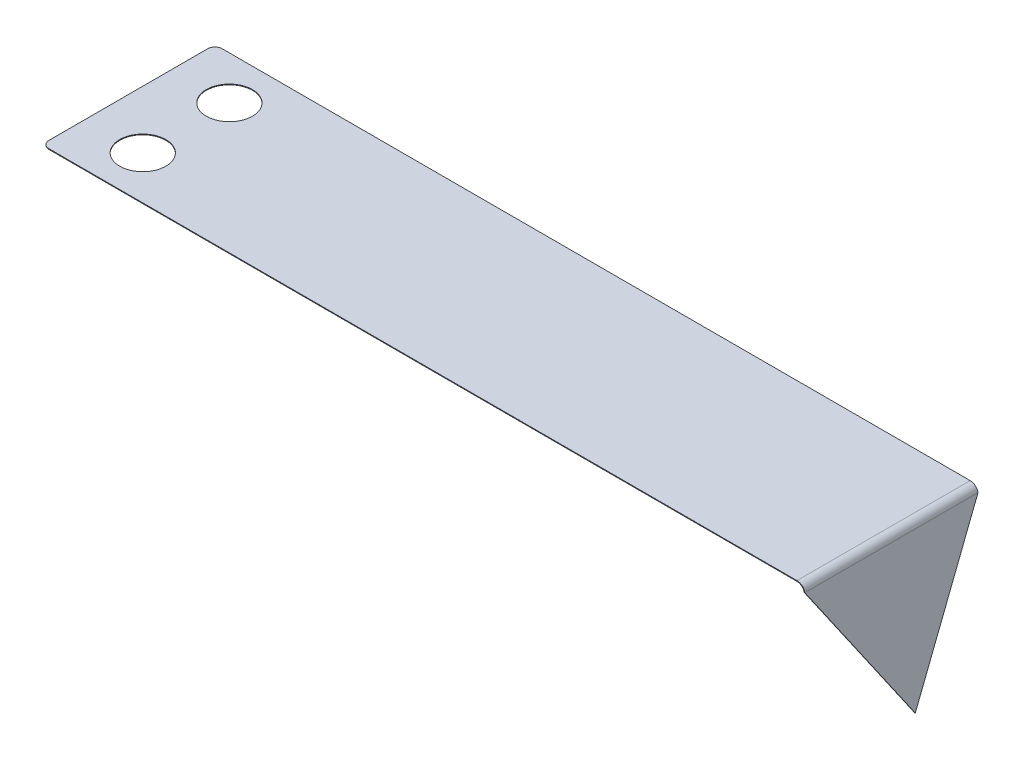
ISO-10303-21;
HEADER;
FILE_DESCRIPTION(('STEP AP214'),'2;1');
FILE_NAME('part.step','',(''),(''),'','','');
FILE_SCHEMA(('AUTOMOTIVE_DESIGN { 1 0 10303 214 1 1 1 1 }'));
ENDSEC;
DATA;
#1=APPLICATION_CONTEXT('core data for automotive mechanical design processes');
#2=APPLICATION_PROTOCOL_DEFINITION('international standard','automotive_design',2000,#1);
#3=PRODUCT_CONTEXT('',#1,'mechanical');
#4=PRODUCT('Part','Part','',(#3));
#5=PRODUCT_RELATED_PRODUCT_CATEGORY('part','',(#4));
#6=PRODUCT_DEFINITION_FORMATION('','',#4);
#7=PRODUCT_DEFINITION_CONTEXT('part definition',#1,'design');
#8=PRODUCT_DEFINITION('design','',#6,#7);
#9=PRODUCT_DEFINITION_SHAPE('','',#8);
#10=(LENGTH_UNIT() NAMED_UNIT(*) SI_UNIT(.MILLI.,.METRE.));
#11=(NAMED_UNIT(*) PLANE_ANGLE_UNIT() SI_UNIT($,.RADIAN.));
#12=(NAMED_UNIT(*) SI_UNIT($,.STERADIAN.) SOLID_ANGLE_UNIT());
#13=UNCERTAINTY_MEASURE_WITH_UNIT(LENGTH_MEASURE(1.E-05),#10,'distance_accuracy_value','');
#14=(GEOMETRIC_REPRESENTATION_CONTEXT(3) GLOBAL_UNCERTAINTY_ASSIGNED_CONTEXT((#13)) GLOBAL_UNIT_ASSIGNED_CONTEXT((#10,
#11,#12)) REPRESENTATION_CONTEXT('',''));
#15=CARTESIAN_POINT('',(0.,0.,0.));
#16=DIRECTION('',(0.,0.,1.));
#17=DIRECTION('',(1.,0.,0.));
#18=AXIS2_PLACEMENT_3D('',#15,#16,#17);
#19=CARTESIAN_POINT('',(25.5938611478472,4.52184061630192,0.));
#20=DIRECTION('',(-0.984807753012208,-0.173648177666934,0.));
#21=DIRECTION('',(0.173648177666934,-0.984807753012207,0.));
#22=AXIS2_PLACEMENT_3D('',#19,#20,#21);
#23=PLANE('',#22);
#24=DIRECTION('',(-0.146986514273729,0.83360194612956,-0.532449772307838));
#25=VECTOR('',#24,1.);
#26=CARTESIAN_POINT('',(28.1276654276339,-9.84807753012207,0.));
#27=LINE('',#26,#25);
#28=CARTESIAN_POINT('',(28.1276654276339,-9.84807753012207,0.));
#29=VERTEX_POINT('',#28);
#30=CARTESIAN_POINT('',(26.4713231179738,-0.454493502283187,-6.));
#31=VERTEX_POINT('',#30);
#32=EDGE_CURVE('E149',#29,#31,#27,.T.);
#33=ORIENTED_EDGE('',*,*,#32,.T.);
#34=DIRECTION('',(0.,0.,1.));
#35=VECTOR('',#34,1.);
#36=CARTESIAN_POINT('',(26.4713231179738,-0.454493502283186,-6.));
#37=LINE('',#36,#35);
#38=CARTESIAN_POINT('',(26.4713231179738,-0.454493502283186,6.));
#39=VERTEX_POINT('',#38);
#40=EDGE_CURVE('E180',#39,#31,#37,.F.);
#41=ORIENTED_EDGE('',*,*,#40,.F.);
#42=DIRECTION('',(-0.146986514273729,0.83360194612956,0.532449772307838));
#43=VECTOR('',#42,1.);
#44=CARTESIAN_POINT('',(26.3122016545442,0.447929160375928,6.57640789286689));
#45=LINE('',#44,#43);
#46=EDGE_CURVE('E274',#29,#39,#45,.T.);
#47=ORIENTED_EDGE('',*,*,#46,.F.);
#48=EDGE_LOOP('',(#33,#41,#47));
#49=FACE_BOUND('',#48,.T.);
#50=ADVANCED_FACE('F65',(#49),#23,.F.);
#51=CARTESIAN_POINT('',(25.5446207601965,4.51315820741857,0.));
#52=DIRECTION('',(-0.984807753012208,-0.173648177666934,0.));
#53=DIRECTION('',(0.173648177666934,-0.984807753012207,0.));
#54=AXIS2_PLACEMENT_3D('',#51,#52,#53);
#55=PLANE('',#54);
#56=DIRECTION('',(0.,0.,1.));
#57=VECTOR('',#56,1.);
#58=CARTESIAN_POINT('',(26.4220827303232,-0.463175911166534,-6.));
#59=LINE('',#58,#57);
#60=CARTESIAN_POINT('',(26.4220827303232,-0.463175911166533,-6.));
#61=VERTEX_POINT('',#60);
#62=CARTESIAN_POINT('',(26.4220827303232,-0.463175911166534,6.));
#63=VERTEX_POINT('',#62);
#64=EDGE_CURVE('E161',#61,#63,#59,.T.);
#65=ORIENTED_EDGE('',*,*,#64,.F.);
#66=DIRECTION('',(-0.146986514273729,0.83360194612956,-0.532449772307838));
#67=VECTOR('',#66,1.);
#68=CARTESIAN_POINT('',(28.0784250399833,-9.85675993900542,0.));
#69=LINE('',#68,#67);
#70=CARTESIAN_POINT('',(28.0784250399833,-9.85675993900542,0.));
#71=VERTEX_POINT('',#70);
#72=EDGE_CURVE('E136',#71,#61,#69,.T.);
#73=ORIENTED_EDGE('',*,*,#72,.F.);
#74=DIRECTION('',(-0.146986514273729,0.83360194612956,0.532449772307838));
#75=VECTOR('',#74,1.);
#76=CARTESIAN_POINT('',(26.2629612668936,0.439246751492581,6.57640789286689));
#77=LINE('',#76,#75);
#78=EDGE_CURVE('E148',#71,#63,#77,.T.);
#79=ORIENTED_EDGE('',*,*,#78,.T.);
#80=EDGE_LOOP('',(#65,#73,#79));
#81=FACE_BOUND('',#80,.T.);
#82=ADVANCED_FACE('F174',(#81),#55,.T.);
#83=CARTESIAN_POINT('',(-26.4,-0.05,6.));
#84=DIRECTION('',(0.,0.,1.));
#85=DIRECTION('',(1.,0.,0.));
#86=AXIS2_PLACEMENT_3D('',#83,#84,#85);
#87=PLANE('',#86);
#88=DIRECTION('',(1.,0.,0.));
#89=VECTOR('',#88,1.);
#90=CARTESIAN_POINT('',(-26.4,0.,6.));
#91=LINE('',#90,#89);
#92=CARTESIAN_POINT('',(-25.9,0.,6.));
#93=VERTEX_POINT('',#92);
#94=CARTESIAN_POINT('',(25.9296788538171,0.,6.));
#95=VERTEX_POINT('',#94);
#96=EDGE_CURVE('E210',#93,#95,#91,.T.);
#97=ORIENTED_EDGE('',*,*,#96,.F.);
#98=DIRECTION('',(0.,1.,0.));
#99=VECTOR('',#98,1.);
#100=CARTESIAN_POINT('',(-25.9,-0.05,6.));
#101=LINE('',#100,#99);
#102=CARTESIAN_POINT('',(-25.9,-0.05,6.));
#103=VERTEX_POINT('',#102);
#104=EDGE_CURVE('E13',#93,#103,#101,.F.);
#105=ORIENTED_EDGE('',*,*,#104,.T.);
#106=DIRECTION('',(1.,0.,0.));
#107=VECTOR('',#106,1.);
#108=CARTESIAN_POINT('',(-26.4,-0.05,6.));
#109=LINE('',#108,#107);
#110=CARTESIAN_POINT('',(25.9296788538171,-0.05,6.));
#111=VERTEX_POINT('',#110);
#112=EDGE_CURVE('E213',#103,#111,#109,.T.);
#113=ORIENTED_EDGE('',*,*,#112,.T.);
#114=DIRECTION('',(0.,1.,0.));
#115=VECTOR('',#114,1.);
#116=CARTESIAN_POINT('',(25.9296788538171,-0.0500000000000014,6.));
#117=LINE('',#116,#115);
#118=EDGE_CURVE('E189',#111,#95,#117,.T.);
#119=ORIENTED_EDGE('',*,*,#118,.T.);
#120=EDGE_LOOP('',(#97,#105,#113,#119));
#121=FACE_BOUND('',#120,.T.);
#122=ADVANCED_FACE('F261',(#121),#87,.T.);
#123=CARTESIAN_POINT('',(0.,-0.05,0.));
#124=DIRECTION('',(0.,-1.,0.));
#125=DIRECTION('',(0.,0.,-1.));
#126=AXIS2_PLACEMENT_3D('',#123,#124,#125);
#127=PLANE('',#126);
#128=CARTESIAN_POINT('',(-22.4,-0.0499999999999997,-3.));
#129=DIRECTION('',(0.,-1.,0.));
#130=DIRECTION('',(0.,0.,-1.));
#131=AXIS2_PLACEMENT_3D('',#128,#129,#130);
#132=CIRCLE('',#131,1.6);
#133=CARTESIAN_POINT('',(-22.4,-0.0499999999999997,-4.6));
#134=VERTEX_POINT('',#133);
#135=EDGE_CURVE('E284',#134,#134,#132,.T.);
#136=ORIENTED_EDGE('',*,*,#135,.F.);
#137=EDGE_LOOP('',(#136));
#138=FACE_BOUND('',#137,.T.);
#139=CARTESIAN_POINT('',(-22.4,-0.0499999999999997,3.));
#140=DIRECTION('',(0.,-1.,0.));
#141=DIRECTION('',(0.,0.,-1.));
#142=AXIS2_PLACEMENT_3D('',#139,#140,#141);
#143=CIRCLE('',#142,1.6);
#144=CARTESIAN_POINT('',(-22.4,-0.0499999999999997,1.4));
#145=VERTEX_POINT('',#144);
#146=EDGE_CURVE('E289',#145,#145,#143,.T.);
#147=ORIENTED_EDGE('',*,*,#146,.F.);
#148=EDGE_LOOP('',(#147));
#149=FACE_BOUND('',#148,.T.);
#150=DIRECTION('',(0.,0.,1.));
#151=VECTOR('',#150,1.);
#152=CARTESIAN_POINT('',(-26.4,-0.05,6.));
#153=LINE('',#152,#151);
#154=CARTESIAN_POINT('',(-26.4,-0.05,-5.5));
#155=VERTEX_POINT('',#154);
#156=CARTESIAN_POINT('',(-26.4,-0.05,5.5));
#157=VERTEX_POINT('',#156);
#158=EDGE_CURVE('E209',#155,#157,#153,.T.);
#159=ORIENTED_EDGE('',*,*,#158,.F.);
#160=CARTESIAN_POINT('',(-25.9,-0.05,-5.5));
#161=DIRECTION('',(0.,-1.,0.));
#162=DIRECTION('',(0.,0.,-1.));
#163=AXIS2_PLACEMENT_3D('',#160,#161,#162);
#164=CIRCLE('',#163,0.5);
#165=CARTESIAN_POINT('',(-25.9,-0.05,-6.));
#166=VERTEX_POINT('',#165);
#167=EDGE_CURVE('E74',#155,#166,#164,.T.);
#168=ORIENTED_EDGE('',*,*,#167,.T.);
#169=DIRECTION('',(-1.,0.,0.));
#170=VECTOR('',#169,1.);
#171=CARTESIAN_POINT('',(-26.4,-0.05,-6.));
#172=LINE('',#171,#170);
#173=CARTESIAN_POINT('',(25.9296788538171,-0.05,-6.));
#174=VERTEX_POINT('',#173);
#175=EDGE_CURVE('E205',#174,#166,#172,.T.);
#176=ORIENTED_EDGE('',*,*,#175,.F.);
#177=DIRECTION('',(0.,0.,1.));
#178=VECTOR('',#177,1.);
#179=CARTESIAN_POINT('',(25.9296788538171,-0.0500000000000014,6.));
#180=LINE('',#179,#178);
#181=EDGE_CURVE('E170',#111,#174,#180,.F.);
#182=ORIENTED_EDGE('',*,*,#181,.F.);
#183=ORIENTED_EDGE('',*,*,#112,.F.);
#184=CARTESIAN_POINT('',(-25.9,-0.05,5.5));
#185=DIRECTION('',(0.,-1.,0.));
#186=DIRECTION('',(0.,0.,-1.));
#187=AXIS2_PLACEMENT_3D('',#184,#185,#186);
#188=CIRCLE('',#187,0.5);
#189=EDGE_CURVE('E86',#103,#157,#188,.T.);
#190=ORIENTED_EDGE('',*,*,#189,.T.);
#191=EDGE_LOOP('',(#159,#168,#176,#182,#183,#190));
#192=FACE_BOUND('',#191,.T.);
#193=ADVANCED_FACE('F246',(#138,#149,#192),#127,.T.);
#194=CARTESIAN_POINT('',(0.,0.,0.));
#195=DIRECTION('',(0.,-1.,0.));
#196=DIRECTION('',(0.,0.,-1.));
#197=AXIS2_PLACEMENT_3D('',#194,#195,#196);
#198=PLANE('',#197);
#199=CARTESIAN_POINT('',(-22.4,0.,-3.));
#200=DIRECTION('',(0.,1.,0.));
#201=DIRECTION('',(0.,0.,1.));
#202=AXIS2_PLACEMENT_3D('',#199,#200,#201);
#203=CIRCLE('',#202,1.6);
#204=CARTESIAN_POINT('',(-22.4,0.,-1.4));
#205=VERTEX_POINT('',#204);
#206=EDGE_CURVE('E293',#205,#205,#203,.T.);
#207=ORIENTED_EDGE('',*,*,#206,.F.);
#208=EDGE_LOOP('',(#207));
#209=FACE_BOUND('',#208,.T.);
#210=CARTESIAN_POINT('',(-22.4,0.,3.));
#211=DIRECTION('',(0.,1.,0.));
#212=DIRECTION('',(0.,0.,1.));
#213=AXIS2_PLACEMENT_3D('',#210,#211,#212);
#214=CIRCLE('',#213,1.6);
#215=CARTESIAN_POINT('',(-22.4,0.,4.6));
#216=VERTEX_POINT('',#215);
#217=EDGE_CURVE('E294',#216,#216,#214,.T.);
#218=ORIENTED_EDGE('',*,*,#217,.F.);
#219=EDGE_LOOP('',(#218));
#220=FACE_BOUND('',#219,.T.);
#221=DIRECTION('',(-1.,0.,0.));
#222=VECTOR('',#221,1.);
#223=CARTESIAN_POINT('',(-26.4,0.,-6.));
#224=LINE('',#223,#222);
#225=CARTESIAN_POINT('',(25.9296788538171,0.,-6.));
#226=VERTEX_POINT('',#225);
#227=CARTESIAN_POINT('',(-25.9,0.,-6.));
#228=VERTEX_POINT('',#227);
#229=EDGE_CURVE('E201',#226,#228,#224,.T.);
#230=ORIENTED_EDGE('',*,*,#229,.T.);
#231=CARTESIAN_POINT('',(-25.9,0.,-5.5));
#232=DIRECTION('',(0.,-1.,0.));
#233=DIRECTION('',(0.,0.,-1.));
#234=AXIS2_PLACEMENT_3D('',#231,#232,#233);
#235=CIRCLE('',#234,0.5);
#236=CARTESIAN_POINT('',(-26.4,0.,-5.5));
#237=VERTEX_POINT('',#236);
#238=EDGE_CURVE('E232',#228,#237,#235,.F.);
#239=ORIENTED_EDGE('',*,*,#238,.T.);
#240=DIRECTION('',(0.,0.,1.));
#241=VECTOR('',#240,1.);
#242=CARTESIAN_POINT('',(-26.4,0.,6.));
#243=LINE('',#242,#241);
#244=CARTESIAN_POINT('',(-26.4,0.,5.5));
#245=VERTEX_POINT('',#244);
#246=EDGE_CURVE('E220',#237,#245,#243,.T.);
#247=ORIENTED_EDGE('',*,*,#246,.T.);
#248=CARTESIAN_POINT('',(-25.9,0.,5.5));
#249=DIRECTION('',(0.,-1.,0.));
#250=DIRECTION('',(0.,0.,-1.));
#251=AXIS2_PLACEMENT_3D('',#248,#249,#250);
#252=CIRCLE('',#251,0.5);
#253=EDGE_CURVE('E229',#245,#93,#252,.F.);
#254=ORIENTED_EDGE('',*,*,#253,.T.);
#255=ORIENTED_EDGE('',*,*,#96,.T.);
#256=DIRECTION('',(0.,0.,1.));
#257=VECTOR('',#256,1.);
#258=CARTESIAN_POINT('',(25.9296788538171,0.,6.));
#259=LINE('',#258,#257);
#260=EDGE_CURVE('E184',#95,#226,#259,.F.);
#261=ORIENTED_EDGE('',*,*,#260,.T.);
#262=EDGE_LOOP('',(#230,#239,#247,#254,#255,#261));
#263=FACE_BOUND('',#262,.T.);
#264=ADVANCED_FACE('F256',(#209,#220,#263),#198,.F.);
#265=CARTESIAN_POINT('',(-26.4,-0.05,6.));
#266=DIRECTION('',(-1.,0.,0.));
#267=DIRECTION('',(0.,0.,1.));
#268=AXIS2_PLACEMENT_3D('',#265,#266,#267);
#269=PLANE('',#268);
#270=ORIENTED_EDGE('',*,*,#246,.F.);
#271=DIRECTION('',(0.,1.,0.));
#272=VECTOR('',#271,1.);
#273=CARTESIAN_POINT('',(-26.4,-0.05,-5.5));
#274=LINE('',#273,#272);
#275=EDGE_CURVE('E239',#237,#155,#274,.F.);
#276=ORIENTED_EDGE('',*,*,#275,.T.);
#277=ORIENTED_EDGE('',*,*,#158,.T.);
#278=DIRECTION('',(0.,1.,0.));
#279=VECTOR('',#278,1.);
#280=CARTESIAN_POINT('',(-26.4,-0.05,5.5));
#281=LINE('',#280,#279);
#282=EDGE_CURVE('E235',#157,#245,#281,.T.);
#283=ORIENTED_EDGE('',*,*,#282,.T.);
#284=EDGE_LOOP('',(#270,#276,#277,#283));
#285=FACE_BOUND('',#284,.T.);
#286=ADVANCED_FACE('F258',(#285),#269,.T.);
#287=CARTESIAN_POINT('',(-26.4,-0.05,-6.));
#288=DIRECTION('',(0.,0.,-1.));
#289=DIRECTION('',(-1.,0.,0.));
#290=AXIS2_PLACEMENT_3D('',#287,#288,#289);
#291=PLANE('',#290);
#292=ORIENTED_EDGE('',*,*,#175,.T.);
#293=DIRECTION('',(0.,1.,0.));
#294=VECTOR('',#293,1.);
#295=CARTESIAN_POINT('',(-25.9,-0.05,-6.));
#296=LINE('',#295,#294);
#297=EDGE_CURVE('E216',#166,#228,#296,.T.);
#298=ORIENTED_EDGE('',*,*,#297,.T.);
#299=ORIENTED_EDGE('',*,*,#229,.F.);
#300=DIRECTION('',(0.,1.,0.));
#301=VECTOR('',#300,1.);
#302=CARTESIAN_POINT('',(25.9296788538171,-0.0500000000000014,-6.));
#303=LINE('',#302,#301);
#304=EDGE_CURVE('E198',#174,#226,#303,.T.);
#305=ORIENTED_EDGE('',*,*,#304,.F.);
#306=EDGE_LOOP('',(#292,#298,#299,#305));
#307=FACE_BOUND('',#306,.T.);
#308=ADVANCED_FACE('F251',(#307),#291,.T.);
#309=CARTESIAN_POINT('',(25.9296788538171,-0.550000000000001,-6.));
#310=DIRECTION('',(0.,0.,-1.));
#311=DIRECTION('',(-1.,0.,0.));
#312=AXIS2_PLACEMENT_3D('',#309,#310,#311);
#313=PLANE('',#312);
#314=DIRECTION('',(-0.984807753012207,-0.173648177666934,0.));
#315=VECTOR('',#314,1.);
#316=CARTESIAN_POINT('',(26.4713231179738,-0.454493502283187,-6.));
#317=LINE('',#316,#315);
#318=EDGE_CURVE('E139',#61,#31,#317,.F.);
#319=ORIENTED_EDGE('',*,*,#318,.F.);
#320=CARTESIAN_POINT('',(25.9296788538171,-0.550000000000001,-6.));
#321=DIRECTION('',(0.,0.,1.));
#322=DIRECTION('',(1.,0.,0.));
#323=AXIS2_PLACEMENT_3D('',#320,#321,#322);
#324=CIRCLE('',#323,0.499999999999999);
#325=EDGE_CURVE('E157',#174,#61,#324,.F.);
#326=ORIENTED_EDGE('',*,*,#325,.F.);
#327=ORIENTED_EDGE('',*,*,#304,.T.);
#328=CARTESIAN_POINT('',(25.9296788538171,-0.550000000000001,-6.));
#329=DIRECTION('',(0.,0.,1.));
#330=DIRECTION('',(1.,0.,0.));
#331=AXIS2_PLACEMENT_3D('',#328,#329,#330);
#332=CIRCLE('',#331,0.549999999999999);
#333=EDGE_CURVE('E159',#226,#31,#332,.F.);
#334=ORIENTED_EDGE('',*,*,#333,.T.);
#335=EDGE_LOOP('',(#319,#326,#327,#334));
#336=FACE_BOUND('',#335,.T.);
#337=ADVANCED_FACE('F155',(#336),#313,.T.);
#338=CARTESIAN_POINT('',(25.9296788538171,-0.550000000000001,6.));
#339=DIRECTION('',(0.,0.,-1.));
#340=DIRECTION('',(-1.,0.,0.));
#341=AXIS2_PLACEMENT_3D('',#338,#339,#340);
#342=PLANE('',#341);
#343=CARTESIAN_POINT('',(25.9296788538171,-0.550000000000001,6.));
#344=DIRECTION('',(0.,0.,1.));
#345=DIRECTION('',(1.,0.,0.));
#346=AXIS2_PLACEMENT_3D('',#343,#344,#345);
#347=CIRCLE('',#346,0.499999999999999);
#348=EDGE_CURVE('E195',#63,#111,#347,.T.);
#349=ORIENTED_EDGE('',*,*,#348,.F.);
#350=DIRECTION('',(-0.984807753012207,-0.173648177666934,0.));
#351=VECTOR('',#350,1.);
#352=CARTESIAN_POINT('',(26.4220827303232,-0.463175911166534,6.));
#353=LINE('',#352,#351);
#354=EDGE_CURVE('E176',#63,#39,#353,.F.);
#355=ORIENTED_EDGE('',*,*,#354,.T.);
#356=CARTESIAN_POINT('',(25.9296788538171,-0.550000000000001,6.));
#357=DIRECTION('',(0.,0.,1.));
#358=DIRECTION('',(1.,0.,0.));
#359=AXIS2_PLACEMENT_3D('',#356,#357,#358);
#360=CIRCLE('',#359,0.549999999999999);
#361=EDGE_CURVE('E172',#39,#95,#360,.T.);
#362=ORIENTED_EDGE('',*,*,#361,.T.);
#363=ORIENTED_EDGE('',*,*,#118,.F.);
#364=EDGE_LOOP('',(#349,#355,#362,#363));
#365=FACE_BOUND('',#364,.T.);
#366=ADVANCED_FACE('F269',(#365),#342,.F.);
#367=CARTESIAN_POINT('',(25.9296788538171,-0.550000000000001,6.));
#368=DIRECTION('',(0.,0.,1.));
#369=DIRECTION('',(0.984807753012208,0.173648177666934,0.));
#370=AXIS2_PLACEMENT_3D('',#367,#368,#369);
#371=CYLINDRICAL_SURFACE('',#370,0.549999999999999);
#372=ORIENTED_EDGE('',*,*,#260,.F.);
#373=ORIENTED_EDGE('',*,*,#361,.F.);
#374=ORIENTED_EDGE('',*,*,#40,.T.);
#375=ORIENTED_EDGE('',*,*,#333,.F.);
#376=EDGE_LOOP('',(#372,#373,#374,#375));
#377=FACE_BOUND('',#376,.T.);
#378=ADVANCED_FACE('F267',(#377),#371,.T.);
#379=CARTESIAN_POINT('',(25.9296788538171,-0.550000000000001,6.));
#380=DIRECTION('',(0.,0.,1.));
#381=DIRECTION('',(0.984807753012208,0.173648177666934,0.));
#382=AXIS2_PLACEMENT_3D('',#379,#380,#381);
#383=CYLINDRICAL_SURFACE('',#382,0.499999999999999);
#384=ORIENTED_EDGE('',*,*,#181,.T.);
#385=ORIENTED_EDGE('',*,*,#325,.T.);
#386=ORIENTED_EDGE('',*,*,#64,.T.);
#387=ORIENTED_EDGE('',*,*,#348,.T.);
#388=EDGE_LOOP('',(#384,#385,#386,#387));
#389=FACE_BOUND('',#388,.T.);
#390=ADVANCED_FACE('F166',(#389),#383,.F.);
#391=CARTESIAN_POINT('',(26.2629612668936,0.439246751492581,6.57640789286689));
#392=DIRECTION('',(0.0924589326604301,-0.524360663858344,0.846461599819703));
#393=DIRECTION('',(-0.146986514273729,0.83360194612956,0.532449772307838));
#394=AXIS2_PLACEMENT_3D('',#391,#392,#393);
#395=PLANE('',#394);
#396=ORIENTED_EDGE('',*,*,#354,.F.);
#397=ORIENTED_EDGE('',*,*,#78,.F.);
#398=DIRECTION('',(-0.984807753012208,-0.173648177666934,0.));
#399=VECTOR('',#398,1.);
#400=CARTESIAN_POINT('',(28.0784250399833,-9.85675993900542,0.));
#401=LINE('',#400,#399);
#402=EDGE_CURVE('E142',#71,#29,#401,.F.);
#403=ORIENTED_EDGE('',*,*,#402,.T.);
#404=ORIENTED_EDGE('',*,*,#46,.T.);
#405=EDGE_LOOP('',(#396,#397,#403,#404));
#406=FACE_BOUND('',#405,.T.);
#407=ADVANCED_FACE('F319',(#406),#395,.T.);
#408=CARTESIAN_POINT('',(28.1276654276339,-9.84807753012207,0.));
#409=DIRECTION('',(-0.0924589326604301,0.524360663858343,0.846461599819703));
#410=DIRECTION('',(-0.146986514273729,0.83360194612956,-0.532449772307838));
#411=AXIS2_PLACEMENT_3D('',#408,#409,#410);
#412=PLANE('',#411);
#413=ORIENTED_EDGE('',*,*,#318,.T.);
#414=ORIENTED_EDGE('',*,*,#32,.F.);
#415=ORIENTED_EDGE('',*,*,#402,.F.);
#416=ORIENTED_EDGE('',*,*,#72,.T.);
#417=EDGE_LOOP('',(#413,#414,#415,#416));
#418=FACE_BOUND('',#417,.T.);
#419=ADVANCED_FACE('F138',(#418),#412,.F.);
#420=CARTESIAN_POINT('',(-22.4,-9.85675993900542,3.));
#421=DIRECTION('',(0.,1.,0.));
#422=DIRECTION('',(0.,0.,1.));
#423=AXIS2_PLACEMENT_3D('',#420,#421,#422);
#424=CYLINDRICAL_SURFACE('',#423,1.6);
#425=ORIENTED_EDGE('',*,*,#146,.T.);
#426=EDGE_LOOP('',(#425));
#427=FACE_BOUND('',#426,.T.);
#428=ORIENTED_EDGE('',*,*,#217,.T.);
#429=EDGE_LOOP('',(#428));
#430=FACE_BOUND('',#429,.T.);
#431=ADVANCED_FACE('F309',(#427,#430),#424,.F.);
#432=CARTESIAN_POINT('',(-22.4,-9.85675993900542,-3.));
#433=DIRECTION('',(0.,1.,0.));
#434=DIRECTION('',(0.,0.,1.));
#435=AXIS2_PLACEMENT_3D('',#432,#433,#434);
#436=CYLINDRICAL_SURFACE('',#435,1.6);
#437=ORIENTED_EDGE('',*,*,#135,.T.);
#438=EDGE_LOOP('',(#437));
#439=FACE_BOUND('',#438,.T.);
#440=ORIENTED_EDGE('',*,*,#206,.T.);
#441=EDGE_LOOP('',(#440));
#442=FACE_BOUND('',#441,.T.);
#443=ADVANCED_FACE('F302',(#439,#442),#436,.F.);
#444=CARTESIAN_POINT('',(-25.9,-0.05,-5.5));
#445=DIRECTION('',(0.,1.,0.));
#446=DIRECTION('',(0.,0.,1.));
#447=AXIS2_PLACEMENT_3D('',#444,#445,#446);
#448=CYLINDRICAL_SURFACE('',#447,0.5);
#449=ORIENTED_EDGE('',*,*,#167,.F.);
#450=ORIENTED_EDGE('',*,*,#275,.F.);
#451=ORIENTED_EDGE('',*,*,#238,.F.);
#452=ORIENTED_EDGE('',*,*,#297,.F.);
#453=EDGE_LOOP('',(#449,#450,#451,#452));
#454=FACE_BOUND('',#453,.T.);
#455=ADVANCED_FACE('F253',(#454),#448,.T.);
#456=CARTESIAN_POINT('',(-25.9,-0.05,5.5));
#457=DIRECTION('',(0.,1.,0.));
#458=DIRECTION('',(0.,0.,1.));
#459=AXIS2_PLACEMENT_3D('',#456,#457,#458);
#460=CYLINDRICAL_SURFACE('',#459,0.5);
#461=ORIENTED_EDGE('',*,*,#189,.F.);
#462=ORIENTED_EDGE('',*,*,#104,.F.);
#463=ORIENTED_EDGE('',*,*,#253,.F.);
#464=ORIENTED_EDGE('',*,*,#282,.F.);
#465=EDGE_LOOP('',(#461,#462,#463,#464));
#466=FACE_BOUND('',#465,.T.);
#467=ADVANCED_FACE('F67',(#466),#460,.T.);
#468=CLOSED_SHELL('',(#50,#82,#122,#193,#264,#286,#308,#337,#366,#378,#390,#407,#419,#431,#443,
#455,#467));
#469=MANIFOLD_SOLID_BREP('B2',#468);
#470=ADVANCED_BREP_SHAPE_REPRESENTATION('',(#18,#469),#14);
#471=SHAPE_DEFINITION_REPRESENTATION(#9,#470);
ENDSEC;
END-ISO-10303-21;
